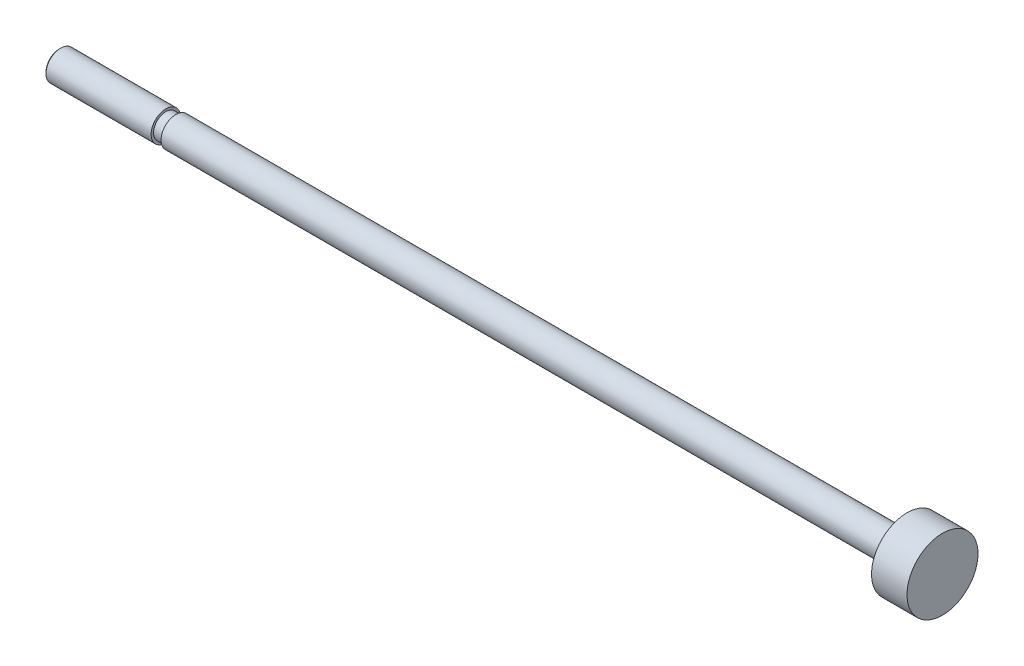
ISO-10303-21;
HEADER;
FILE_DESCRIPTION(('STEP AP214'),'2;1');
FILE_NAME('part.step','',(''),(''),'','','');
FILE_SCHEMA(('AUTOMOTIVE_DESIGN { 1 0 10303 214 1 1 1 1 }'));
ENDSEC;
DATA;
#1=APPLICATION_CONTEXT('core data for automotive mechanical design processes');
#2=APPLICATION_PROTOCOL_DEFINITION('international standard','automotive_design',2000,#1);
#3=PRODUCT_CONTEXT('',#1,'mechanical');
#4=PRODUCT('Part','Part','',(#3));
#5=PRODUCT_RELATED_PRODUCT_CATEGORY('part','',(#4));
#6=PRODUCT_DEFINITION_FORMATION('','',#4);
#7=PRODUCT_DEFINITION_CONTEXT('part definition',#1,'design');
#8=PRODUCT_DEFINITION('design','',#6,#7);
#9=PRODUCT_DEFINITION_SHAPE('','',#8);
#10=(LENGTH_UNIT() NAMED_UNIT(*) SI_UNIT(.MILLI.,.METRE.));
#11=(NAMED_UNIT(*) PLANE_ANGLE_UNIT() SI_UNIT($,.RADIAN.));
#12=(NAMED_UNIT(*) SI_UNIT($,.STERADIAN.) SOLID_ANGLE_UNIT());
#13=UNCERTAINTY_MEASURE_WITH_UNIT(LENGTH_MEASURE(1.E-05),#10,'distance_accuracy_value','');
#14=(GEOMETRIC_REPRESENTATION_CONTEXT(3) GLOBAL_UNCERTAINTY_ASSIGNED_CONTEXT((#13)) GLOBAL_UNIT_ASSIGNED_CONTEXT((#10,
#11,#12)) REPRESENTATION_CONTEXT('',''));
#15=CARTESIAN_POINT('',(0.,0.,0.));
#16=DIRECTION('',(0.,0.,1.));
#17=DIRECTION('',(1.,0.,0.));
#18=AXIS2_PLACEMENT_3D('',#15,#16,#17);
#19=CARTESIAN_POINT('',(-4.99999,0.,0.));
#20=DIRECTION('',(1.,0.,0.));
#21=DIRECTION('',(0.,0.,-1.));
#22=AXIS2_PLACEMENT_3D('',#19,#20,#21);
#23=CYLINDRICAL_SURFACE('',#22,4.99999);
#24=CARTESIAN_POINT('',(-4.99999,0.,0.));
#25=DIRECTION('',(1.,0.,0.));
#26=DIRECTION('',(0.,0.,-1.));
#27=AXIS2_PLACEMENT_3D('',#24,#25,#26);
#28=CIRCLE('',#27,4.99999);
#29=CARTESIAN_POINT('',(-4.99999,0.,-4.99999));
#30=VERTEX_POINT('',#29);
#31=EDGE_CURVE('E60',#30,#30,#28,.T.);
#32=ORIENTED_EDGE('',*,*,#31,.T.);
#33=EDGE_LOOP('',(#32));
#34=FACE_BOUND('',#33,.T.);
#35=CARTESIAN_POINT('',(0.,0.,0.));
#36=DIRECTION('',(1.,0.,0.));
#37=DIRECTION('',(0.,0.,-1.));
#38=AXIS2_PLACEMENT_3D('',#35,#36,#37);
#39=CIRCLE('',#38,4.99999);
#40=CARTESIAN_POINT('',(0.,0.,-4.99999));
#41=VERTEX_POINT('',#40);
#42=EDGE_CURVE('E61',#41,#41,#39,.T.);
#43=ORIENTED_EDGE('',*,*,#42,.F.);
#44=EDGE_LOOP('',(#43));
#45=FACE_BOUND('',#44,.T.);
#46=ADVANCED_FACE('F39',(#34,#45),#23,.T.);
#47=CARTESIAN_POINT('',(-4.99999,0.,0.));
#48=DIRECTION('',(1.,0.,0.));
#49=DIRECTION('',(0.,0.,-1.));
#50=AXIS2_PLACEMENT_3D('',#47,#48,#49);
#51=PLANE('',#50);
#52=CARTESIAN_POINT('',(-4.99999,0.,0.));
#53=DIRECTION('',(1.,0.,0.));
#54=DIRECTION('',(0.,0.,-1.));
#55=AXIS2_PLACEMENT_3D('',#52,#53,#54);
#56=CIRCLE('',#55,2.0828);
#57=CARTESIAN_POINT('',(-4.99999,0.,-2.0828));
#58=VERTEX_POINT('',#57);
#59=EDGE_CURVE('E64',#58,#58,#56,.T.);
#60=ORIENTED_EDGE('',*,*,#59,.T.);
#61=EDGE_LOOP('',(#60));
#62=FACE_BOUND('',#61,.T.);
#63=ORIENTED_EDGE('',*,*,#31,.F.);
#64=EDGE_LOOP('',(#63));
#65=FACE_BOUND('',#64,.T.);
#66=ADVANCED_FACE('F96',(#62,#65),#51,.F.);
#67=CARTESIAN_POINT('',(0.,0.,0.));
#68=DIRECTION('',(1.,0.,0.));
#69=DIRECTION('',(0.,0.,-1.));
#70=AXIS2_PLACEMENT_3D('',#67,#68,#69);
#71=PLANE('',#70);
#72=ORIENTED_EDGE('',*,*,#42,.T.);
#73=EDGE_LOOP('',(#72));
#74=FACE_BOUND('',#73,.T.);
#75=ADVANCED_FACE('F102',(#74),#71,.T.);
#76=CARTESIAN_POINT('',(-107.999884076,0.,0.));
#77=DIRECTION('',(1.,0.,0.));
#78=DIRECTION('',(0.,0.,-1.));
#79=AXIS2_PLACEMENT_3D('',#76,#77,#78);
#80=CYLINDRICAL_SURFACE('',#79,2.0828);
#81=CARTESIAN_POINT('',(-107.999884076,0.,0.));
#82=DIRECTION('',(1.,0.,0.));
#83=DIRECTION('',(0.,0.,-1.));
#84=AXIS2_PLACEMENT_3D('',#81,#82,#83);
#85=CIRCLE('',#84,2.0828);
#86=CARTESIAN_POINT('',(-107.999884076,0.,-2.0828));
#87=VERTEX_POINT('',#86);
#88=EDGE_CURVE('E69',#87,#87,#85,.T.);
#89=ORIENTED_EDGE('',*,*,#88,.T.);
#90=EDGE_LOOP('',(#89));
#91=FACE_BOUND('',#90,.T.);
#92=ORIENTED_EDGE('',*,*,#59,.F.);
#93=EDGE_LOOP('',(#92));
#94=FACE_BOUND('',#93,.T.);
#95=ADVANCED_FACE('F125',(#91,#94),#80,.T.);
#96=CARTESIAN_POINT('',(-107.999884076,0.,0.));
#97=DIRECTION('',(1.,0.,0.));
#98=DIRECTION('',(0.,0.,-1.));
#99=AXIS2_PLACEMENT_3D('',#96,#97,#98);
#100=PLANE('',#99);
#101=CARTESIAN_POINT('',(-107.999884076,0.,0.));
#102=DIRECTION('',(1.,0.,0.));
#103=DIRECTION('',(0.,0.,-1.));
#104=AXIS2_PLACEMENT_3D('',#101,#102,#103);
#105=CIRCLE('',#104,1.929511);
#106=CARTESIAN_POINT('',(-107.999884076,0.,-1.929511));
#107=VERTEX_POINT('',#106);
#108=EDGE_CURVE('E55',#107,#107,#105,.T.);
#109=ORIENTED_EDGE('',*,*,#108,.T.);
#110=EDGE_LOOP('',(#109));
#111=FACE_BOUND('',#110,.T.);
#112=ORIENTED_EDGE('',*,*,#88,.F.);
#113=EDGE_LOOP('',(#112));
#114=FACE_BOUND('',#113,.T.);
#115=ADVANCED_FACE('F91',(#111,#114),#100,.F.);
#116=CARTESIAN_POINT('',(-109.399678076,0.,0.));
#117=DIRECTION('',(1.,0.,0.));
#118=DIRECTION('',(0.,0.,-1.));
#119=AXIS2_PLACEMENT_3D('',#116,#117,#118);
#120=CYLINDRICAL_SURFACE('',#119,1.732788);
#121=CARTESIAN_POINT('',(-108.196607076,0.,0.));
#122=DIRECTION('',(1.,0.,0.));
#123=DIRECTION('',(0.,0.,-1.));
#124=AXIS2_PLACEMENT_3D('',#121,#122,#123);
#125=CIRCLE('',#124,1.732788);
#126=CARTESIAN_POINT('',(-108.196607076,0.,-1.732788));
#127=VERTEX_POINT('',#126);
#128=EDGE_CURVE('E51',#127,#127,#125,.F.);
#129=ORIENTED_EDGE('',*,*,#128,.T.);
#130=EDGE_LOOP('',(#129));
#131=FACE_BOUND('',#130,.T.);
#132=CARTESIAN_POINT('',(-109.399678076,0.,0.));
#133=DIRECTION('',(1.,0.,0.));
#134=DIRECTION('',(0.,0.,-1.));
#135=AXIS2_PLACEMENT_3D('',#132,#133,#134);
#136=CIRCLE('',#135,1.732788);
#137=CARTESIAN_POINT('',(-109.399678076,0.,-1.732788));
#138=VERTEX_POINT('',#137);
#139=EDGE_CURVE('E72',#138,#138,#136,.T.);
#140=ORIENTED_EDGE('',*,*,#139,.T.);
#141=EDGE_LOOP('',(#140));
#142=FACE_BOUND('',#141,.T.);
#143=ADVANCED_FACE('F84',(#131,#142),#120,.T.);
#144=CARTESIAN_POINT('',(-124.399648076,0.,0.));
#145=DIRECTION('',(1.,0.,0.));
#146=DIRECTION('',(0.,0.,-1.));
#147=AXIS2_PLACEMENT_3D('',#144,#145,#146);
#148=CYLINDRICAL_SURFACE('',#147,2.0828);
#149=CARTESIAN_POINT('',(-124.209148076,0.,0.));
#150=DIRECTION('',(1.,0.,0.));
#151=DIRECTION('',(0.,0.,-1.));
#152=AXIS2_PLACEMENT_3D('',#149,#150,#151);
#153=CIRCLE('',#152,2.0828);
#154=CARTESIAN_POINT('',(-124.209148076,0.,-2.0828));
#155=VERTEX_POINT('',#154);
#156=EDGE_CURVE('E47',#155,#155,#153,.T.);
#157=ORIENTED_EDGE('',*,*,#156,.T.);
#158=EDGE_LOOP('',(#157));
#159=FACE_BOUND('',#158,.T.);
#160=CARTESIAN_POINT('',(-109.399678076,0.,0.));
#161=DIRECTION('',(1.,0.,0.));
#162=DIRECTION('',(0.,0.,-1.));
#163=AXIS2_PLACEMENT_3D('',#160,#161,#162);
#164=CIRCLE('',#163,2.0828);
#165=CARTESIAN_POINT('',(-109.399678076,0.,-2.0828));
#166=VERTEX_POINT('',#165);
#167=EDGE_CURVE('E75',#166,#166,#164,.T.);
#168=ORIENTED_EDGE('',*,*,#167,.F.);
#169=EDGE_LOOP('',(#168));
#170=FACE_BOUND('',#169,.T.);
#171=ADVANCED_FACE('F81',(#159,#170),#148,.T.);
#172=CARTESIAN_POINT('',(-124.399648076,0.,0.));
#173=DIRECTION('',(1.,0.,0.));
#174=DIRECTION('',(0.,0.,-1.));
#175=AXIS2_PLACEMENT_3D('',#172,#173,#174);
#176=PLANE('',#175);
#177=CARTESIAN_POINT('',(-124.399648076,0.,0.));
#178=DIRECTION('',(1.,0.,0.));
#179=DIRECTION('',(0.,0.,-1.));
#180=AXIS2_PLACEMENT_3D('',#177,#178,#179);
#181=CIRCLE('',#180,1.8923);
#182=CARTESIAN_POINT('',(-124.399648076,0.,-1.8923));
#183=VERTEX_POINT('',#182);
#184=EDGE_CURVE('E10',#183,#183,#181,.F.);
#185=ORIENTED_EDGE('',*,*,#184,.T.);
#186=EDGE_LOOP('',(#185));
#187=FACE_BOUND('',#186,.T.);
#188=ADVANCED_FACE('F83',(#187),#176,.F.);
#189=CARTESIAN_POINT('',(-109.399678076,0.,0.));
#190=DIRECTION('',(1.,0.,0.));
#191=DIRECTION('',(0.,0.,-1.));
#192=AXIS2_PLACEMENT_3D('',#189,#190,#191);
#193=PLANE('',#192);
#194=ORIENTED_EDGE('',*,*,#139,.F.);
#195=EDGE_LOOP('',(#194));
#196=FACE_BOUND('',#195,.T.);
#197=ORIENTED_EDGE('',*,*,#167,.T.);
#198=EDGE_LOOP('',(#197));
#199=FACE_BOUND('',#198,.T.);
#200=ADVANCED_FACE('F79',(#196,#199),#193,.T.);
#201=CARTESIAN_POINT('',(-107.996582076,0.,0.));
#202=DIRECTION('',(1.,0.,0.));
#203=DIRECTION('',(0.,0.,-1.));
#204=AXIS2_PLACEMENT_3D('',#201,#202,#203);
#205=CONICAL_SURFACE('',#204,1.932813,0.78539816339745);
#206=ORIENTED_EDGE('',*,*,#128,.F.);
#207=EDGE_LOOP('',(#206));
#208=FACE_BOUND('',#207,.T.);
#209=ORIENTED_EDGE('',*,*,#108,.F.);
#210=EDGE_LOOP('',(#209));
#211=FACE_BOUND('',#210,.T.);
#212=ADVANCED_FACE('F108',(#208,#211),#205,.T.);
#213=CARTESIAN_POINT('',(-124.209148076,0.,0.));
#214=DIRECTION('',(1.,0.,0.));
#215=DIRECTION('',(0.,0.,-1.));
#216=AXIS2_PLACEMENT_3D('',#213,#214,#215);
#217=CONICAL_SURFACE('',#216,2.0828,0.78539816339746);
#218=ORIENTED_EDGE('',*,*,#184,.F.);
#219=EDGE_LOOP('',(#218));
#220=FACE_BOUND('',#219,.T.);
#221=ORIENTED_EDGE('',*,*,#156,.F.);
#222=EDGE_LOOP('',(#221));
#223=FACE_BOUND('',#222,.T.);
#224=ADVANCED_FACE('F42',(#220,#223),#217,.T.);
#225=CLOSED_SHELL('',(#46,#66,#75,#95,#115,#143,#171,#188,#200,#212,#224));
#226=MANIFOLD_SOLID_BREP('B2',#225);
#227=ADVANCED_BREP_SHAPE_REPRESENTATION('',(#18,#226),#14);
#228=SHAPE_DEFINITION_REPRESENTATION(#9,#227);
ENDSEC;
END-ISO-10303-21;
